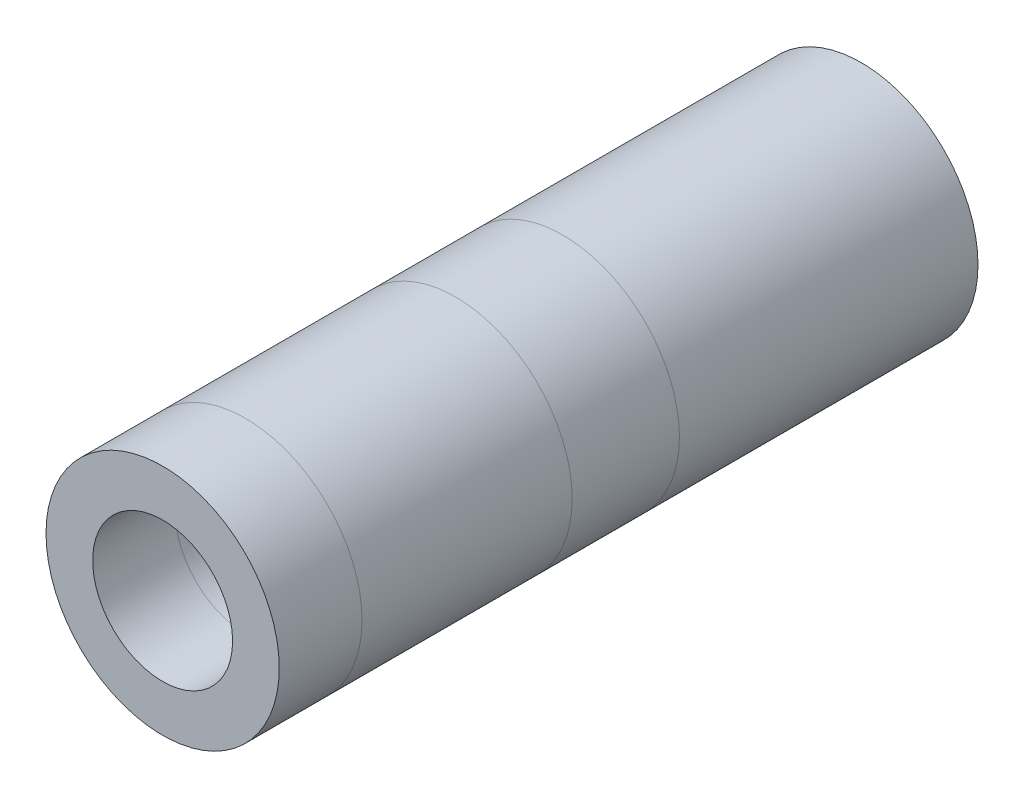
ISO-10303-21;
HEADER;
FILE_DESCRIPTION(('STEP AP214'),'2;1');
FILE_NAME('part.step','',(''),(''),'','','');
FILE_SCHEMA(('AUTOMOTIVE_DESIGN { 1 0 10303 214 1 1 1 1 }'));
ENDSEC;
DATA;
#1=APPLICATION_CONTEXT('core data for automotive mechanical design processes');
#2=APPLICATION_PROTOCOL_DEFINITION('international standard','automotive_design',2000,#1);
#3=PRODUCT_CONTEXT('',#1,'mechanical');
#4=PRODUCT('Part','Part','',(#3));
#5=PRODUCT_RELATED_PRODUCT_CATEGORY('part','',(#4));
#6=PRODUCT_DEFINITION_FORMATION('','',#4);
#7=PRODUCT_DEFINITION_CONTEXT('part definition',#1,'design');
#8=PRODUCT_DEFINITION('design','',#6,#7);
#9=PRODUCT_DEFINITION_SHAPE('','',#8);
#10=(LENGTH_UNIT() NAMED_UNIT(*) SI_UNIT(.MILLI.,.METRE.));
#11=(NAMED_UNIT(*) PLANE_ANGLE_UNIT() SI_UNIT($,.RADIAN.));
#12=(NAMED_UNIT(*) SI_UNIT($,.STERADIAN.) SOLID_ANGLE_UNIT());
#13=UNCERTAINTY_MEASURE_WITH_UNIT(LENGTH_MEASURE(1.E-05),#10,'distance_accuracy_value','');
#14=(GEOMETRIC_REPRESENTATION_CONTEXT(3) GLOBAL_UNCERTAINTY_ASSIGNED_CONTEXT((#13)) GLOBAL_UNIT_ASSIGNED_CONTEXT((#10,
#11,#12)) REPRESENTATION_CONTEXT('',''));
#15=CARTESIAN_POINT('',(0.,0.,0.));
#16=DIRECTION('',(0.,0.,1.));
#17=DIRECTION('',(1.,0.,0.));
#18=AXIS2_PLACEMENT_3D('',#15,#16,#17);
#19=CARTESIAN_POINT('',(-3.82352648422748E-13,-1.97176132541789E-13,-27.6200000000001));
#20=DIRECTION('',(0.,0.,-1.));
#21=DIRECTION('',(-1.,0.,0.));
#22=AXIS2_PLACEMENT_3D('',#19,#20,#21);
#23=PLANE('',#22);
#24=CARTESIAN_POINT('',(-3.82352648422748E-13,-1.97176132541789E-13,-27.6200000000001));
#25=DIRECTION('',(0.,0.,-1.));
#26=DIRECTION('',(-1.,0.,0.));
#27=AXIS2_PLACEMENT_3D('',#24,#25,#26);
#28=CIRCLE('',#27,4.7625);
#29=CARTESIAN_POINT('',(-4.76250000000038,-1.97176132541789E-13,-27.6200000000001));
#30=VERTEX_POINT('',#29);
#31=EDGE_CURVE('E78',#30,#30,#28,.T.);
#32=ORIENTED_EDGE('',*,*,#31,.F.);
#33=EDGE_LOOP('',(#32));
#34=FACE_BOUND('',#33,.T.);
#35=CARTESIAN_POINT('',(-3.82352648422748E-13,-1.97176132541789E-13,-27.6200000000001));
#36=DIRECTION('',(0.,0.,-1.));
#37=DIRECTION('',(-1.,0.,0.));
#38=AXIS2_PLACEMENT_3D('',#35,#36,#37);
#39=CIRCLE('',#38,7.9375);
#40=CARTESIAN_POINT('',(-7.93750000000038,-1.97176132541789E-13,-27.6200000000002));
#41=VERTEX_POINT('',#40);
#42=EDGE_CURVE('E75',#41,#41,#39,.T.);
#43=ORIENTED_EDGE('',*,*,#42,.T.);
#44=EDGE_LOOP('',(#43));
#45=FACE_BOUND('',#44,.T.);
#46=ADVANCED_FACE('F56',(#34,#45),#23,.T.);
#47=CARTESIAN_POINT('',(0.,0.,19.9354444998134));
#48=DIRECTION('',(0.,0.,-1.));
#49=DIRECTION('',(-1.,0.,0.));
#50=AXIS2_PLACEMENT_3D('',#47,#48,#49);
#51=PLANE('',#50);
#52=CARTESIAN_POINT('',(-5.32884847741313E-13,-2.7473115708648E-13,19.9354444998134));
#53=DIRECTION('',(0.,0.,-1.));
#54=DIRECTION('',(-1.,0.,0.));
#55=AXIS2_PLACEMENT_3D('',#52,#53,#54);
#56=CIRCLE('',#55,4.7625);
#57=CARTESIAN_POINT('',(4.76249999999947,-2.7473115708648E-13,19.9354444998134));
#58=VERTEX_POINT('',#57);
#59=EDGE_CURVE('E81',#58,#58,#56,.T.);
#60=ORIENTED_EDGE('',*,*,#59,.T.);
#61=EDGE_LOOP('',(#60));
#62=FACE_BOUND('',#61,.T.);
#63=CARTESIAN_POINT('',(0.,0.,19.9354444998134));
#64=DIRECTION('',(0.,0.,-1.));
#65=DIRECTION('',(-1.,0.,0.));
#66=AXIS2_PLACEMENT_3D('',#63,#64,#65);
#67=CIRCLE('',#66,7.9375);
#68=CARTESIAN_POINT('',(-7.9375,0.,19.9354444998132));
#69=VERTEX_POINT('',#68);
#70=EDGE_CURVE('E11',#69,#69,#67,.T.);
#71=ORIENTED_EDGE('',*,*,#70,.F.);
#72=EDGE_LOOP('',(#71));
#73=FACE_BOUND('',#72,.T.);
#74=ADVANCED_FACE('F94',(#62,#73),#51,.F.);
#75=CARTESIAN_POINT('',(-3.82352648422748E-13,-1.97176132541789E-13,-27.6200000000001));
#76=DIRECTION('',(0.,0.,1.));
#77=DIRECTION('',(1.,0.,0.));
#78=AXIS2_PLACEMENT_3D('',#75,#76,#77);
#79=CYLINDRICAL_SURFACE('',#78,7.9375);
#80=CARTESIAN_POINT('',(-3.82352648422748E-13,-1.97176132541789E-13,-7.30000000000006));
#81=DIRECTION('',(0.,0.,-1.));
#82=DIRECTION('',(-1.,0.,0.));
#83=AXIS2_PLACEMENT_3D('',#80,#81,#82);
#84=CIRCLE('',#83,7.9375);
#85=CARTESIAN_POINT('',(-7.93750000000038,-1.97176132541789E-13,-7.30000000000021));
#86=VERTEX_POINT('',#85);
#87=EDGE_CURVE('E70',#86,#86,#84,.T.);
#88=ORIENTED_EDGE('',*,*,#87,.T.);
#89=EDGE_LOOP('',(#88));
#90=FACE_BOUND('',#89,.T.);
#91=ORIENTED_EDGE('',*,*,#42,.F.);
#92=EDGE_LOOP('',(#91));
#93=FACE_BOUND('',#92,.T.);
#94=ADVANCED_FACE('F126',(#90,#93),#79,.T.);
#95=CARTESIAN_POINT('',(-3.82352648422748E-13,-1.97176132541789E-13,-7.30000000000005));
#96=DIRECTION('',(0.,0.,1.));
#97=DIRECTION('',(1.,0.,0.));
#98=AXIS2_PLACEMENT_3D('',#95,#96,#97);
#99=CYLINDRICAL_SURFACE('',#98,7.9375);
#100=CARTESIAN_POINT('',(-3.82352648422748E-13,-1.97176132541789E-13,0.));
#101=DIRECTION('',(0.,0.,-1.));
#102=DIRECTION('',(-1.,0.,0.));
#103=AXIS2_PLACEMENT_3D('',#100,#101,#102);
#104=CIRCLE('',#103,7.9375);
#105=CARTESIAN_POINT('',(-7.93750000000038,-1.97176132541789E-13,-2.07748747282049E-13));
#106=VERTEX_POINT('',#105);
#107=EDGE_CURVE('E66',#106,#106,#104,.T.);
#108=ORIENTED_EDGE('',*,*,#107,.T.);
#109=EDGE_LOOP('',(#108));
#110=FACE_BOUND('',#109,.T.);
#111=ORIENTED_EDGE('',*,*,#87,.F.);
#112=EDGE_LOOP('',(#111));
#113=FACE_BOUND('',#112,.T.);
#114=ADVANCED_FACE('F128',(#110,#113),#99,.T.);
#115=CARTESIAN_POINT('',(-5.32698307916746E-13,-2.74449124721605E-13,0.));
#116=DIRECTION('',(0.,0.,1.));
#117=DIRECTION('',(1.,0.,0.));
#118=AXIS2_PLACEMENT_3D('',#115,#116,#117);
#119=CYLINDRICAL_SURFACE('',#118,7.9375);
#120=CARTESIAN_POINT('',(-4.24837977257636E-13,-2.19012269972456E-13,14.3020000898132));
#121=DIRECTION('',(0.,0.,-1.));
#122=DIRECTION('',(-1.,0.,0.));
#123=AXIS2_PLACEMENT_3D('',#120,#121,#122);
#124=CIRCLE('',#123,7.9375);
#125=CARTESIAN_POINT('',(-7.93750000000043,-2.19012269972456E-13,14.3020000898131));
#126=VERTEX_POINT('',#125);
#127=EDGE_CURVE('E62',#126,#126,#124,.T.);
#128=ORIENTED_EDGE('',*,*,#127,.T.);
#129=EDGE_LOOP('',(#128));
#130=FACE_BOUND('',#129,.T.);
#131=ORIENTED_EDGE('',*,*,#107,.F.);
#132=EDGE_LOOP('',(#131));
#133=FACE_BOUND('',#132,.T.);
#134=ADVANCED_FACE('F135',(#130,#133),#119,.T.);
#135=CARTESIAN_POINT('',(1.0786033065911E-13,0.,14.3020000898132));
#136=DIRECTION('',(0.,0.,1.));
#137=DIRECTION('',(1.,0.,0.));
#138=AXIS2_PLACEMENT_3D('',#135,#136,#137);
#139=CYLINDRICAL_SURFACE('',#138,7.9375);
#140=ORIENTED_EDGE('',*,*,#70,.T.);
#141=EDGE_LOOP('',(#140));
#142=FACE_BOUND('',#141,.T.);
#143=ORIENTED_EDGE('',*,*,#127,.F.);
#144=EDGE_LOOP('',(#143));
#145=FACE_BOUND('',#144,.T.);
#146=ADVANCED_FACE('F118',(#142,#145),#139,.T.);
#147=CARTESIAN_POINT('',(-3.82352648422748E-13,-1.97176132541789E-13,-32.62));
#148=DIRECTION('',(0.,0.,1.));
#149=DIRECTION('',(1.,0.,0.));
#150=AXIS2_PLACEMENT_3D('',#147,#148,#149);
#151=CYLINDRICAL_SURFACE('',#150,4.7625);
#152=CARTESIAN_POINT('',(-3.82352648422748E-13,-1.97176132541789E-13,-7.30000000000006));
#153=DIRECTION('',(0.,0.,-1.));
#154=DIRECTION('',(-1.,0.,0.));
#155=AXIS2_PLACEMENT_3D('',#152,#153,#154);
#156=CIRCLE('',#155,4.7625);
#157=CARTESIAN_POINT('',(-4.76250000000038,-1.97176132541789E-13,-7.30000000000015));
#158=VERTEX_POINT('',#157);
#159=EDGE_CURVE('E82',#158,#158,#156,.T.);
#160=ORIENTED_EDGE('',*,*,#159,.F.);
#161=EDGE_LOOP('',(#160));
#162=FACE_BOUND('',#161,.T.);
#163=ORIENTED_EDGE('',*,*,#31,.T.);
#164=EDGE_LOOP('',(#163));
#165=FACE_BOUND('',#164,.T.);
#166=ADVANCED_FACE('F102',(#162,#165),#151,.F.);
#167=CARTESIAN_POINT('',(-3.82352648422748E-13,-1.97176132541789E-13,-7.30000000000006));
#168=DIRECTION('',(0.,0.,1.));
#169=DIRECTION('',(1.,0.,0.));
#170=AXIS2_PLACEMENT_3D('',#167,#168,#169);
#171=CYLINDRICAL_SURFACE('',#170,4.7625);
#172=CARTESIAN_POINT('',(-3.82352648422748E-13,-1.97176132541789E-13,0.));
#173=DIRECTION('',(0.,0.,-1.));
#174=DIRECTION('',(-1.,0.,0.));
#175=AXIS2_PLACEMENT_3D('',#172,#173,#174);
#176=CIRCLE('',#175,4.7625);
#177=CARTESIAN_POINT('',(-4.76250000000038,-1.97176132541789E-13,-1.50323155813686E-13));
#178=VERTEX_POINT('',#177);
#179=EDGE_CURVE('E85',#178,#178,#176,.T.);
#180=ORIENTED_EDGE('',*,*,#179,.F.);
#181=EDGE_LOOP('',(#180));
#182=FACE_BOUND('',#181,.T.);
#183=ORIENTED_EDGE('',*,*,#159,.T.);
#184=EDGE_LOOP('',(#183));
#185=FACE_BOUND('',#184,.T.);
#186=ADVANCED_FACE('F107',(#182,#185),#171,.F.);
#187=CARTESIAN_POINT('',(-5.32698307916746E-13,-2.74449124721605E-13,0.));
#188=DIRECTION('',(0.,0.,1.));
#189=DIRECTION('',(1.,0.,0.));
#190=AXIS2_PLACEMENT_3D('',#187,#188,#189);
#191=CYLINDRICAL_SURFACE('',#190,4.7625);
#192=CARTESIAN_POINT('',(-4.24837977257636E-13,-2.19012269972456E-13,14.3020000898132));
#193=DIRECTION('',(0.,0.,-1.));
#194=DIRECTION('',(-1.,0.,0.));
#195=AXIS2_PLACEMENT_3D('',#192,#193,#194);
#196=CIRCLE('',#195,4.7625);
#197=CARTESIAN_POINT('',(4.76249999999958,-2.19012269972456E-13,14.3020000898133));
#198=VERTEX_POINT('',#197);
#199=EDGE_CURVE('E88',#198,#198,#196,.T.);
#200=ORIENTED_EDGE('',*,*,#199,.F.);
#201=EDGE_LOOP('',(#200));
#202=FACE_BOUND('',#201,.T.);
#203=ORIENTED_EDGE('',*,*,#179,.T.);
#204=EDGE_LOOP('',(#203));
#205=FACE_BOUND('',#204,.T.);
#206=ADVANCED_FACE('F100',(#202,#205),#191,.F.);
#207=CARTESIAN_POINT('',(-4.24837977257636E-13,-2.19012269972456E-13,14.3020000898132));
#208=DIRECTION('',(0.,0.,1.));
#209=DIRECTION('',(1.,0.,0.));
#210=AXIS2_PLACEMENT_3D('',#207,#208,#209);
#211=CYLINDRICAL_SURFACE('',#210,4.7625);
#212=CARTESIAN_POINT('',(4.76249999999947,-2.7473115708648E-13,19.9354444998134));
#213=CARTESIAN_POINT('',(4.76249999999947,-2.74150752012375E-13,19.8767627872093));
#214=CARTESIAN_POINT('',(4.76249999999947,-2.73570346938271E-13,19.8180810746051));
#215=CARTESIAN_POINT('',(4.76249999999947,-2.72409536790062E-13,19.7007176493968));
#216=CARTESIAN_POINT('',(4.76249999999947,-2.71829131715958E-13,19.6420359367926));
#217=CARTESIAN_POINT('',(4.76249999999947,-2.70668321567749E-13,19.5246725115843));
#218=CARTESIAN_POINT('',(4.76249999999948,-2.70087916493644E-13,19.4659907989801));
#219=CARTESIAN_POINT('',(4.76249999999948,-2.68927106345435E-13,19.3486273737718));
#220=CARTESIAN_POINT('',(4.76249999999948,-2.68346701271331E-13,19.2899456611676));
#221=CARTESIAN_POINT('',(4.76249999999948,-2.67185891123122E-13,19.1725822359593));
#222=CARTESIAN_POINT('',(4.76249999999948,-2.66605486049018E-13,19.1139005233551));
#223=CARTESIAN_POINT('',(4.76249999999949,-2.65444675900809E-13,18.9965370981468));
#224=CARTESIAN_POINT('',(4.76249999999949,-2.64864270826705E-13,18.9378553855426));
#225=CARTESIAN_POINT('',(4.76249999999949,-2.63703460678496E-13,18.8204919603343));
#226=CARTESIAN_POINT('',(4.76249999999949,-2.63123055604391E-13,18.7618102477301));
#227=CARTESIAN_POINT('',(4.76249999999949,-2.61962245456183E-13,18.6444468225218));
#228=CARTESIAN_POINT('',(4.76249999999949,-2.61381840382078E-13,18.5857651099176));
#229=CARTESIAN_POINT('',(4.7624999999995,-2.60221030233869E-13,18.4684016847092));
#230=CARTESIAN_POINT('',(4.7624999999995,-2.59640625159765E-13,18.4097199721051));
#231=CARTESIAN_POINT('',(4.7624999999995,-2.58479815011556E-13,18.2923565468967));
#232=CARTESIAN_POINT('',(4.7624999999995,-2.57899409937452E-13,18.2336748342926));
#233=CARTESIAN_POINT('',(4.7624999999995,-2.56738599789243E-13,18.1163114090842));
#234=CARTESIAN_POINT('',(4.7624999999995,-2.56158194715138E-13,18.0576296964801));
#235=CARTESIAN_POINT('',(4.7624999999995,-2.5499738456693E-13,17.9402662712717));
#236=CARTESIAN_POINT('',(4.76249999999951,-2.54416979492825E-13,17.8815845586676));
#237=CARTESIAN_POINT('',(4.76249999999951,-2.53256169344616E-13,17.7642211334592));
#238=CARTESIAN_POINT('',(4.76249999999951,-2.52675764270512E-13,17.7055394208551));
#239=CARTESIAN_POINT('',(4.76249999999951,-2.51514954122303E-13,17.5881759956467));
#240=CARTESIAN_POINT('',(4.76249999999951,-2.50934549048199E-13,17.5294942830426));
#241=CARTESIAN_POINT('',(4.76249999999952,-2.4977373889999E-13,17.4121308578342));
#242=CARTESIAN_POINT('',(4.76249999999952,-2.49193333825886E-13,17.3534491452301));
#243=CARTESIAN_POINT('',(4.76249999999952,-2.48032523677677E-13,17.2360857200217));
#244=CARTESIAN_POINT('',(4.76249999999952,-2.47452118603572E-13,17.1774040074176));
#245=CARTESIAN_POINT('',(4.76249999999952,-2.46291308455363E-13,17.0600405822092));
#246=CARTESIAN_POINT('',(4.76249999999952,-2.45710903381259E-13,17.0013588696051));
#247=CARTESIAN_POINT('',(4.76249999999953,-2.4455009323305E-13,16.8839954443967));
#248=CARTESIAN_POINT('',(4.76249999999953,-2.43969688158946E-13,16.8253137317925));
#249=CARTESIAN_POINT('',(4.76249999999953,-2.42808878010737E-13,16.7079503065842));
#250=CARTESIAN_POINT('',(4.76249999999953,-2.42228472936633E-13,16.64926859398));
#251=CARTESIAN_POINT('',(4.76249999999953,-2.41067662788424E-13,16.5319051687717));
#252=CARTESIAN_POINT('',(4.76249999999953,-2.40487257714319E-13,16.4732234561675));
#253=CARTESIAN_POINT('',(4.76249999999954,-2.3932644756611E-13,16.3558600309592));
#254=CARTESIAN_POINT('',(4.76249999999954,-2.38746042492006E-13,16.297178318355));
#255=CARTESIAN_POINT('',(4.76249999999954,-2.37585232343797E-13,16.1798148931467));
#256=CARTESIAN_POINT('',(4.76249999999954,-2.37004827269693E-13,16.1211331805425));
#257=CARTESIAN_POINT('',(4.76249999999954,-2.35844017121484E-13,16.0037697553342));
#258=CARTESIAN_POINT('',(4.76249999999954,-2.3526361204738E-13,15.94508804273));
#259=CARTESIAN_POINT('',(4.76249999999955,-2.34102801899171E-13,15.8277246175217));
#260=CARTESIAN_POINT('',(4.76249999999955,-2.33522396825066E-13,15.7690429049175));
#261=CARTESIAN_POINT('',(4.76249999999955,-2.32361586676858E-13,15.6516794797092));
#262=CARTESIAN_POINT('',(4.76249999999955,-2.31781181602753E-13,15.592997767105));
#263=CARTESIAN_POINT('',(4.76249999999955,-2.30620371454544E-13,15.4756343418967));
#264=CARTESIAN_POINT('',(4.76249999999955,-2.3003996638044E-13,15.4169526292925));
#265=CARTESIAN_POINT('',(4.76249999999956,-2.28879156232231E-13,15.2995892040842));
#266=CARTESIAN_POINT('',(4.76249999999956,-2.28298751158127E-13,15.24090749148));
#267=CARTESIAN_POINT('',(4.76249999999956,-2.27137941009918E-13,15.1235440662717));
#268=CARTESIAN_POINT('',(4.76249999999956,-2.26557535935813E-13,15.0648623536675));
#269=CARTESIAN_POINT('',(4.76249999999956,-2.25396725787605E-13,14.9474989284592));
#270=CARTESIAN_POINT('',(4.76249999999956,-2.248163207135E-13,14.888817215855));
#271=CARTESIAN_POINT('',(4.76249999999957,-2.23655510565291E-13,14.7714537906467));
#272=CARTESIAN_POINT('',(4.76249999999957,-2.23075105491187E-13,14.7127720780425));
#273=CARTESIAN_POINT('',(4.76249999999957,-2.21914295342978E-13,14.5954086528342));
#274=CARTESIAN_POINT('',(4.76249999999957,-2.21333890268874E-13,14.53672694023));
#275=CARTESIAN_POINT('',(4.76249999999957,-2.20173080120665E-13,14.4193635150217));
#276=CARTESIAN_POINT('',(4.76249999999957,-2.19592675046561E-13,14.3606818024175));
#277=CARTESIAN_POINT('',(4.76249999999958,-2.19012269972456E-13,14.3020000898133));
#278=B_SPLINE_CURVE_WITH_KNOTS('',3,(#212,#213,#214,#215,#216,#217,#218,#219,#220,#221,#222,
#223,#224,#225,#226,#227,#228,#229,#230,#231,#232,#233,#234,#235,#236,#237,#238,#239,#240,#241,
#242,#243,#244,#245,#246,#247,#248,#249,#250,#251,#252,#253,#254,#255,#256,#257,#258,#259,#260,
#261,#262,#263,#264,#265,#266,#267,#268,#269,#270,#271,#272,#273,#274,#275,#276,#277),
.UNSPECIFIED.,.F.,.F.,(4,2,2,2,2,2,2,2,2,2,2,2,2,2,2,2,2,2,2,2,2,2,2,2,2,2,2,2,2,2,2,2,4),(0.,
0.176045137812501,0.352090275625005,0.528135413437509,0.704180551250013,0.880225689062517,
1.05627082687502,1.23231596468752,1.40836110250003,1.58440624031253,1.76045137812503,
1.93649651593754,2.11254165375004,2.28858679156254,2.46463192937505,2.64067706718755,
2.81672220500005,2.99276734281256,3.16881248062506,3.34485761843756,3.52090275625007,
3.69694789406257,3.87299303187507,4.04903816968758,4.22508330750008,4.40112844531258,
4.57717358312509,4.75321872093759,4.92926385875009,5.1053089965626,5.2813541343751,
5.4573992721876,5.63344441000011),.UNSPECIFIED.);
#279=EDGE_CURVE('BSEAM97',#58,#198,#278,.T.);
#280=ORIENTED_EDGE('',*,*,#59,.F.);
#281=ORIENTED_EDGE('',*,*,#199,.T.);
#282=ORIENTED_EDGE('',*,*,#279,.T.);
#283=ORIENTED_EDGE('',*,*,#279,.F.);
#284=EDGE_LOOP('',(#280,#282,#281,#283));
#285=FACE_BOUND('',#284,.T.);
#286=ADVANCED_FACE('F97',(#285),#211,.F.);
#287=CLOSED_SHELL('',(#46,#74,#94,#114,#134,#146,#166,#186,#206,#286));
#288=MANIFOLD_SOLID_BREP('B2',#287);
#289=ADVANCED_BREP_SHAPE_REPRESENTATION('',(#18,#288),#14);
#290=SHAPE_DEFINITION_REPRESENTATION(#9,#289);
ENDSEC;
END-ISO-10303-21;
